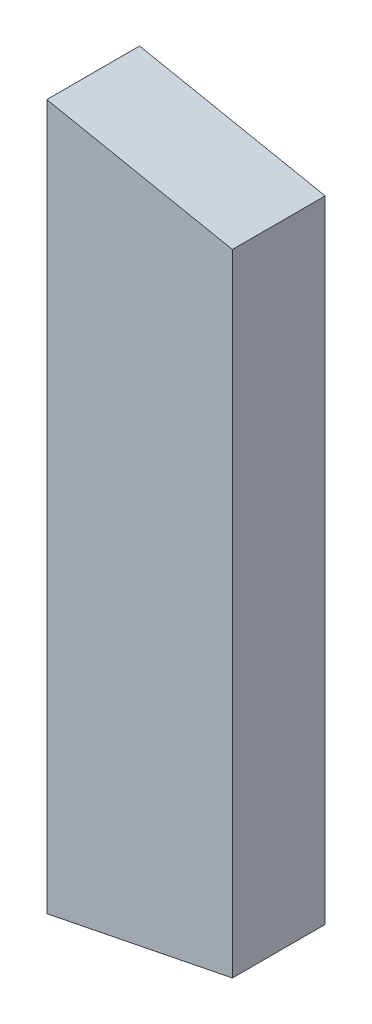
ISO-10303-21;
HEADER;
FILE_DESCRIPTION(('STEP AP214'),'2;1');
FILE_NAME('part.step','',(''),(''),'','','');
FILE_SCHEMA(('AUTOMOTIVE_DESIGN { 1 0 10303 214 1 1 1 1 }'));
ENDSEC;
DATA;
#1=APPLICATION_CONTEXT('core data for automotive mechanical design processes');
#2=APPLICATION_PROTOCOL_DEFINITION('international standard','automotive_design',2000,#1);
#3=PRODUCT_CONTEXT('',#1,'mechanical');
#4=PRODUCT('Part','Part','',(#3));
#5=PRODUCT_RELATED_PRODUCT_CATEGORY('part','',(#4));
#6=PRODUCT_DEFINITION_FORMATION('','',#4);
#7=PRODUCT_DEFINITION_CONTEXT('part definition',#1,'design');
#8=PRODUCT_DEFINITION('design','',#6,#7);
#9=PRODUCT_DEFINITION_SHAPE('','',#8);
#10=(LENGTH_UNIT() NAMED_UNIT(*) SI_UNIT(.MILLI.,.METRE.));
#11=(NAMED_UNIT(*) PLANE_ANGLE_UNIT() SI_UNIT($,.RADIAN.));
#12=(NAMED_UNIT(*) SI_UNIT($,.STERADIAN.) SOLID_ANGLE_UNIT());
#13=UNCERTAINTY_MEASURE_WITH_UNIT(LENGTH_MEASURE(1.E-05),#10,'distance_accuracy_value','');
#14=(GEOMETRIC_REPRESENTATION_CONTEXT(3) GLOBAL_UNCERTAINTY_ASSIGNED_CONTEXT((#13)) GLOBAL_UNIT_ASSIGNED_CONTEXT((#10,
#11,#12)) REPRESENTATION_CONTEXT('',''));
#15=CARTESIAN_POINT('',(0.,0.,0.));
#16=DIRECTION('',(0.,0.,1.));
#17=DIRECTION('',(1.,0.,0.));
#18=AXIS2_PLACEMENT_3D('',#15,#16,#17);
#19=CARTESIAN_POINT('',(5.00000000000001,-19.,5.));
#20=DIRECTION('',(-1.,0.,0.));
#21=DIRECTION('',(0.,0.,1.));
#22=AXIS2_PLACEMENT_3D('',#19,#20,#21);
#23=PLANE('',#22);
#24=DIRECTION('',(0.,1.,0.));
#25=VECTOR('',#24,1.);
#26=CARTESIAN_POINT('',(5.00000000000001,-19.,5.));
#27=LINE('',#26,#25);
#28=CARTESIAN_POINT('',(5.00000000000001,-17.0018727046052,5.));
#29=VERTEX_POINT('',#28);
#30=CARTESIAN_POINT('',(5.00000000000001,17.0018727046052,5.));
#31=VERTEX_POINT('',#30);
#32=EDGE_CURVE('E85',#29,#31,#27,.T.);
#33=ORIENTED_EDGE('',*,*,#32,.F.);
#34=DIRECTION('',(0.,0.,-1.));
#35=VECTOR('',#34,1.);
#36=CARTESIAN_POINT('',(5.00000000000001,-17.0018727046052,5.));
#37=LINE('',#36,#35);
#38=CARTESIAN_POINT('',(5.00000000000001,-17.0018727046052,0.));
#39=VERTEX_POINT('',#38);
#40=EDGE_CURVE('E98',#29,#39,#37,.T.);
#41=ORIENTED_EDGE('',*,*,#40,.T.);
#42=DIRECTION('',(0.,1.,0.));
#43=VECTOR('',#42,1.);
#44=CARTESIAN_POINT('',(5.00000000000001,-19.,0.));
#45=LINE('',#44,#43);
#46=CARTESIAN_POINT('',(5.00000000000001,17.0018727046052,0.));
#47=VERTEX_POINT('',#46);
#48=EDGE_CURVE('E95',#39,#47,#45,.T.);
#49=ORIENTED_EDGE('',*,*,#48,.T.);
#50=DIRECTION('',(0.,0.,1.));
#51=VECTOR('',#50,1.);
#52=CARTESIAN_POINT('',(5.00000000000001,17.0018727046052,5.));
#53=LINE('',#52,#51);
#54=EDGE_CURVE('E46',#47,#31,#53,.T.);
#55=ORIENTED_EDGE('',*,*,#54,.T.);
#56=EDGE_LOOP('',(#33,#41,#49,#55));
#57=FACE_BOUND('',#56,.T.);
#58=ADVANCED_FACE('F32',(#57),#23,.F.);
#59=CARTESIAN_POINT('',(-4.99999999999999,-19.,5.));
#60=DIRECTION('',(1.,0.,0.));
#61=DIRECTION('',(0.,0.,-1.));
#62=AXIS2_PLACEMENT_3D('',#59,#60,#61);
#63=PLANE('',#62);
#64=DIRECTION('',(0.,-1.,0.));
#65=VECTOR('',#64,1.);
#66=CARTESIAN_POINT('',(-4.99999999999999,-19.,0.));
#67=LINE('',#66,#65);
#68=CARTESIAN_POINT('',(-4.99999999999999,19.,0.));
#69=VERTEX_POINT('',#68);
#70=CARTESIAN_POINT('',(-4.99999999999999,-19.,0.));
#71=VERTEX_POINT('',#70);
#72=EDGE_CURVE('E91',#69,#71,#67,.T.);
#73=ORIENTED_EDGE('',*,*,#72,.T.);
#74=DIRECTION('',(0.,0.,-1.));
#75=VECTOR('',#74,1.);
#76=CARTESIAN_POINT('',(-4.99999999999999,-19.,5.));
#77=LINE('',#76,#75);
#78=CARTESIAN_POINT('',(-4.99999999999999,-19.,5.));
#79=VERTEX_POINT('',#78);
#80=EDGE_CURVE('E53',#79,#71,#77,.T.);
#81=ORIENTED_EDGE('',*,*,#80,.F.);
#82=DIRECTION('',(0.,-1.,0.));
#83=VECTOR('',#82,1.);
#84=CARTESIAN_POINT('',(-4.99999999999999,-19.,5.));
#85=LINE('',#84,#83);
#86=CARTESIAN_POINT('',(-4.99999999999999,19.,5.));
#87=VERTEX_POINT('',#86);
#88=EDGE_CURVE('E83',#87,#79,#85,.T.);
#89=ORIENTED_EDGE('',*,*,#88,.F.);
#90=DIRECTION('',(0.,0.,-1.));
#91=VECTOR('',#90,1.);
#92=CARTESIAN_POINT('',(-4.99999999999999,19.,5.));
#93=LINE('',#92,#91);
#94=EDGE_CURVE('E69',#87,#69,#93,.T.);
#95=ORIENTED_EDGE('',*,*,#94,.T.);
#96=EDGE_LOOP('',(#73,#81,#89,#95));
#97=FACE_BOUND('',#96,.T.);
#98=ADVANCED_FACE('F88',(#97),#63,.F.);
#99=CARTESIAN_POINT('',(0.,0.,5.));
#100=DIRECTION('',(0.,0.,-1.));
#101=DIRECTION('',(-1.,0.,0.));
#102=AXIS2_PLACEMENT_3D('',#99,#100,#101);
#103=PLANE('',#102);
#104=ORIENTED_EDGE('',*,*,#88,.T.);
#105=DIRECTION('',(-0.980615975254961,-0.195939554645717,0.));
#106=VECTOR('',#105,1.);
#107=CARTESIAN_POINT('',(10.,-16.0028090569077,5.));
#108=LINE('',#107,#106);
#109=EDGE_CURVE('E86',#29,#79,#108,.T.);
#110=ORIENTED_EDGE('',*,*,#109,.F.);
#111=ORIENTED_EDGE('',*,*,#32,.T.);
#112=DIRECTION('',(0.980615975254961,-0.195939554645717,0.));
#113=VECTOR('',#112,1.);
#114=CARTESIAN_POINT('',(-4.99999999999999,19.,5.));
#115=LINE('',#114,#113);
#116=EDGE_CURVE('E72',#87,#31,#115,.T.);
#117=ORIENTED_EDGE('',*,*,#116,.F.);
#118=EDGE_LOOP('',(#104,#110,#111,#117));
#119=FACE_BOUND('',#118,.T.);
#120=ADVANCED_FACE('F81',(#119),#103,.F.);
#121=CARTESIAN_POINT('',(0.,0.,0.));
#122=DIRECTION('',(0.,0.,-1.));
#123=DIRECTION('',(-1.,0.,0.));
#124=AXIS2_PLACEMENT_3D('',#121,#122,#123);
#125=PLANE('',#124);
#126=DIRECTION('',(0.980615975254961,0.195939554645717,0.));
#127=VECTOR('',#126,1.);
#128=CARTESIAN_POINT('',(3.4587261465549,-17.3098388402299,0.));
#129=LINE('',#128,#127);
#130=EDGE_CURVE('E11',#71,#39,#129,.T.);
#131=ORIENTED_EDGE('',*,*,#130,.F.);
#132=ORIENTED_EDGE('',*,*,#72,.F.);
#133=DIRECTION('',(-0.980615975254961,0.195939554645717,0.));
#134=VECTOR('',#133,1.);
#135=CARTESIAN_POINT('',(3.4587261465549,17.3098388402299,0.));
#136=LINE('',#135,#134);
#137=EDGE_CURVE('E39',#47,#69,#136,.T.);
#138=ORIENTED_EDGE('',*,*,#137,.F.);
#139=ORIENTED_EDGE('',*,*,#48,.F.);
#140=EDGE_LOOP('',(#131,#132,#138,#139));
#141=FACE_BOUND('',#140,.T.);
#142=ADVANCED_FACE('F100',(#141),#125,.T.);
#143=CARTESIAN_POINT('',(-4.99999999999999,19.,-22.));
#144=DIRECTION('',(-0.195939554645717,-0.980615975254961,0.));
#145=DIRECTION('',(0.980615975254961,-0.195939554645717,0.));
#146=AXIS2_PLACEMENT_3D('',#143,#144,#145);
#147=PLANE('',#146);
#148=ORIENTED_EDGE('',*,*,#137,.T.);
#149=ORIENTED_EDGE('',*,*,#94,.F.);
#150=ORIENTED_EDGE('',*,*,#116,.T.);
#151=ORIENTED_EDGE('',*,*,#54,.F.);
#152=EDGE_LOOP('',(#148,#149,#150,#151));
#153=FACE_BOUND('',#152,.T.);
#154=ADVANCED_FACE('F71',(#153),#147,.F.);
#155=CARTESIAN_POINT('',(10.,-16.0028090569077,-22.));
#156=DIRECTION('',(-0.195939554645717,0.980615975254961,0.));
#157=DIRECTION('',(-0.980615975254961,-0.195939554645717,0.));
#158=AXIS2_PLACEMENT_3D('',#155,#156,#157);
#159=PLANE('',#158);
#160=ORIENTED_EDGE('',*,*,#109,.T.);
#161=ORIENTED_EDGE('',*,*,#80,.T.);
#162=ORIENTED_EDGE('',*,*,#130,.T.);
#163=ORIENTED_EDGE('',*,*,#40,.F.);
#164=EDGE_LOOP('',(#160,#161,#162,#163));
#165=FACE_BOUND('',#164,.T.);
#166=ADVANCED_FACE('F103',(#165),#159,.F.);
#167=CLOSED_SHELL('',(#58,#98,#120,#142,#154,#166));
#168=MANIFOLD_SOLID_BREP('B2',#167);
#169=ADVANCED_BREP_SHAPE_REPRESENTATION('',(#18,#168),#14);
#170=SHAPE_DEFINITION_REPRESENTATION(#9,#169);
ENDSEC;
END-ISO-10303-21;
